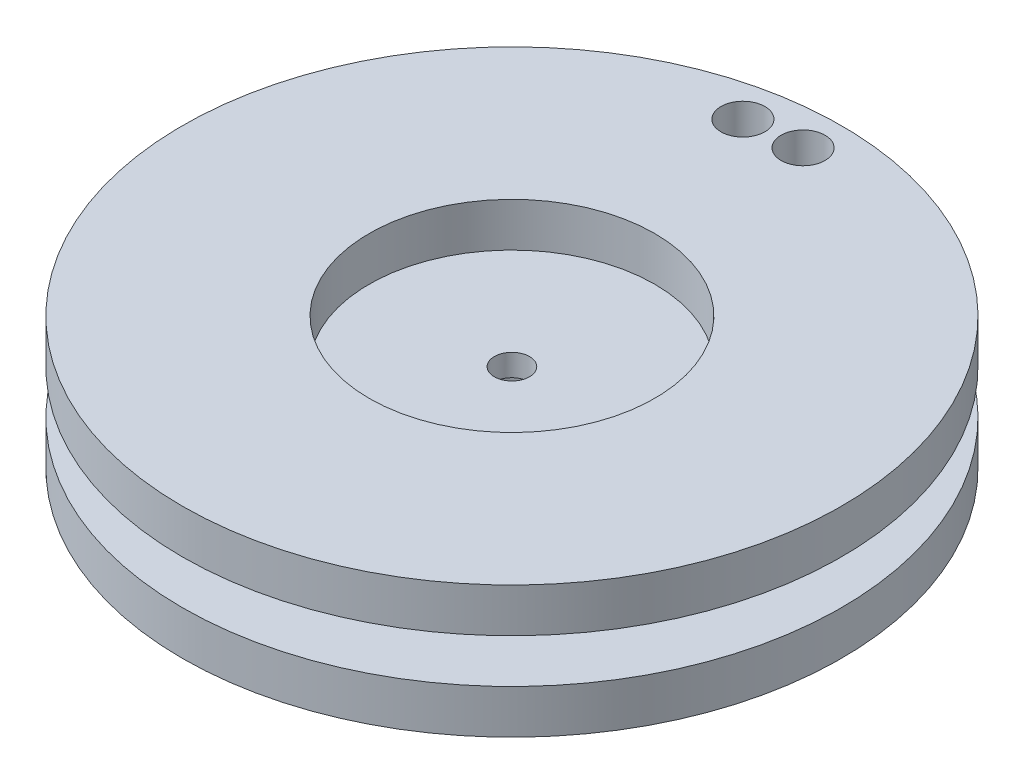
ISO-10303-21;
HEADER;
FILE_DESCRIPTION(('STEP AP214'),'2;1');
FILE_NAME('part.step','',(''),(''),'','','');
FILE_SCHEMA(('AUTOMOTIVE_DESIGN { 1 0 10303 214 1 1 1 1 }'));
ENDSEC;
DATA;
#1=APPLICATION_CONTEXT('core data for automotive mechanical design processes');
#2=APPLICATION_PROTOCOL_DEFINITION('international standard','automotive_design',2000,#1);
#3=PRODUCT_CONTEXT('',#1,'mechanical');
#4=PRODUCT('Part','Part','',(#3));
#5=PRODUCT_RELATED_PRODUCT_CATEGORY('part','',(#4));
#6=PRODUCT_DEFINITION_FORMATION('','',#4);
#7=PRODUCT_DEFINITION_CONTEXT('part definition',#1,'design');
#8=PRODUCT_DEFINITION('design','',#6,#7);
#9=PRODUCT_DEFINITION_SHAPE('','',#8);
#10=(LENGTH_UNIT() NAMED_UNIT(*) SI_UNIT(.MILLI.,.METRE.));
#11=(NAMED_UNIT(*) PLANE_ANGLE_UNIT() SI_UNIT($,.RADIAN.));
#12=(NAMED_UNIT(*) SI_UNIT($,.STERADIAN.) SOLID_ANGLE_UNIT());
#13=UNCERTAINTY_MEASURE_WITH_UNIT(LENGTH_MEASURE(1.E-05),#10,'distance_accuracy_value','');
#14=(GEOMETRIC_REPRESENTATION_CONTEXT(3) GLOBAL_UNCERTAINTY_ASSIGNED_CONTEXT((#13)) GLOBAL_UNIT_ASSIGNED_CONTEXT((#10,
#11,#12)) REPRESENTATION_CONTEXT('',''));
#15=CARTESIAN_POINT('',(0.,0.,0.));
#16=DIRECTION('',(0.,0.,1.));
#17=DIRECTION('',(1.,0.,0.));
#18=AXIS2_PLACEMENT_3D('',#15,#16,#17);
#19=CARTESIAN_POINT('',(0.,2.,0.));
#20=DIRECTION('',(0.,-1.,0.));
#21=DIRECTION('',(0.,0.,-1.));
#22=AXIS2_PLACEMENT_3D('',#19,#20,#21);
#23=CYLINDRICAL_SURFACE('',#22,15.);
#24=CARTESIAN_POINT('',(0.,2.,0.));
#25=DIRECTION('',(0.,1.,0.));
#26=DIRECTION('',(0.,0.,1.));
#27=AXIS2_PLACEMENT_3D('',#24,#25,#26);
#28=CIRCLE('',#27,15.);
#29=CARTESIAN_POINT('',(0.,2.,15.));
#30=VERTEX_POINT('',#29);
#31=EDGE_CURVE('E51',#30,#30,#28,.T.);
#32=ORIENTED_EDGE('',*,*,#31,.F.);
#33=EDGE_LOOP('',(#32));
#34=FACE_BOUND('',#33,.T.);
#35=CARTESIAN_POINT('',(0.,0.,0.));
#36=DIRECTION('',(0.,1.,0.));
#37=DIRECTION('',(0.,0.,1.));
#38=AXIS2_PLACEMENT_3D('',#35,#36,#37);
#39=CIRCLE('',#38,15.);
#40=CARTESIAN_POINT('',(0.,0.,15.));
#41=VERTEX_POINT('',#40);
#42=EDGE_CURVE('E56',#41,#41,#39,.T.);
#43=ORIENTED_EDGE('',*,*,#42,.T.);
#44=EDGE_LOOP('',(#43));
#45=FACE_BOUND('',#44,.T.);
#46=ADVANCED_FACE('F44',(#34,#45),#23,.T.);
#47=CARTESIAN_POINT('',(0.,2.,0.));
#48=DIRECTION('',(0.,1.,0.));
#49=DIRECTION('',(0.,0.,1.));
#50=AXIS2_PLACEMENT_3D('',#47,#48,#49);
#51=PLANE('',#50);
#52=CARTESIAN_POINT('',(0.,2.,-13.25));
#53=DIRECTION('',(0.,1.,0.));
#54=DIRECTION('',(0.,0.,1.));
#55=AXIS2_PLACEMENT_3D('',#52,#53,#54);
#56=CIRCLE('',#55,1.);
#57=CARTESIAN_POINT('',(0.,2.,-12.25));
#58=VERTEX_POINT('',#57);
#59=EDGE_CURVE('E85',#58,#58,#56,.T.);
#60=ORIENTED_EDGE('',*,*,#59,.F.);
#61=EDGE_LOOP('',(#60));
#62=FACE_BOUND('',#61,.T.);
#63=CARTESIAN_POINT('',(-2.5,2.,-13.0120136796731));
#64=DIRECTION('',(0.,1.,0.));
#65=DIRECTION('',(0.,0.,1.));
#66=AXIS2_PLACEMENT_3D('',#63,#64,#65);
#67=CIRCLE('',#66,1.);
#68=CARTESIAN_POINT('',(-2.5,2.,-12.0120136796731));
#69=VERTEX_POINT('',#68);
#70=EDGE_CURVE('E65',#69,#69,#67,.T.);
#71=ORIENTED_EDGE('',*,*,#70,.F.);
#72=EDGE_LOOP('',(#71));
#73=FACE_BOUND('',#72,.T.);
#74=CARTESIAN_POINT('',(0.,2.,0.));
#75=DIRECTION('',(0.,1.,0.));
#76=DIRECTION('',(0.,0.,1.));
#77=AXIS2_PLACEMENT_3D('',#74,#75,#76);
#78=CIRCLE('',#77,12.);
#79=CARTESIAN_POINT('',(0.,2.,12.));
#80=VERTEX_POINT('',#79);
#81=EDGE_CURVE('E12',#80,#80,#78,.T.);
#82=ORIENTED_EDGE('',*,*,#81,.F.);
#83=EDGE_LOOP('',(#82));
#84=FACE_BOUND('',#83,.T.);
#85=ORIENTED_EDGE('',*,*,#31,.T.);
#86=EDGE_LOOP('',(#85));
#87=FACE_BOUND('',#86,.T.);
#88=ADVANCED_FACE('F132',(#62,#73,#84,#87),#51,.T.);
#89=CARTESIAN_POINT('',(0.,0.,0.));
#90=DIRECTION('',(0.,1.,0.));
#91=DIRECTION('',(0.,0.,1.));
#92=AXIS2_PLACEMENT_3D('',#89,#90,#91);
#93=PLANE('',#92);
#94=CARTESIAN_POINT('',(0.,0.,-13.25));
#95=DIRECTION('',(0.,1.,0.));
#96=DIRECTION('',(0.,0.,1.));
#97=AXIS2_PLACEMENT_3D('',#94,#95,#96);
#98=CIRCLE('',#97,1.);
#99=CARTESIAN_POINT('',(0.,0.,-12.25));
#100=VERTEX_POINT('',#99);
#101=EDGE_CURVE('E66',#100,#100,#98,.T.);
#102=ORIENTED_EDGE('',*,*,#101,.T.);
#103=EDGE_LOOP('',(#102));
#104=FACE_BOUND('',#103,.T.);
#105=CARTESIAN_POINT('',(-2.5,0.,-13.0120136796731));
#106=DIRECTION('',(0.,1.,0.));
#107=DIRECTION('',(0.,0.,1.));
#108=AXIS2_PLACEMENT_3D('',#105,#106,#107);
#109=CIRCLE('',#108,1.);
#110=CARTESIAN_POINT('',(-2.5,0.,-12.0120136796731));
#111=VERTEX_POINT('',#110);
#112=EDGE_CURVE('E77',#111,#111,#109,.T.);
#113=ORIENTED_EDGE('',*,*,#112,.T.);
#114=EDGE_LOOP('',(#113));
#115=FACE_BOUND('',#114,.T.);
#116=CARTESIAN_POINT('',(0.,0.,0.));
#117=DIRECTION('',(0.,-1.,0.));
#118=DIRECTION('',(0.,0.,-1.));
#119=AXIS2_PLACEMENT_3D('',#116,#117,#118);
#120=CIRCLE('',#119,2.5);
#121=CARTESIAN_POINT('',(0.,0.,-2.5));
#122=VERTEX_POINT('',#121);
#123=EDGE_CURVE('E98',#122,#122,#120,.T.);
#124=ORIENTED_EDGE('',*,*,#123,.F.);
#125=EDGE_LOOP('',(#124));
#126=FACE_BOUND('',#125,.T.);
#127=ORIENTED_EDGE('',*,*,#42,.F.);
#128=EDGE_LOOP('',(#127));
#129=FACE_BOUND('',#128,.T.);
#130=ADVANCED_FACE('F137',(#104,#115,#126,#129),#93,.F.);
#131=CARTESIAN_POINT('',(0.,4.,0.));
#132=DIRECTION('',(0.,-1.,0.));
#133=DIRECTION('',(0.,0.,-1.));
#134=AXIS2_PLACEMENT_3D('',#131,#132,#133);
#135=CYLINDRICAL_SURFACE('',#134,12.);
#136=CARTESIAN_POINT('',(0.,4.,0.));
#137=DIRECTION('',(0.,1.,0.));
#138=DIRECTION('',(0.,0.,1.));
#139=AXIS2_PLACEMENT_3D('',#136,#137,#138);
#140=CIRCLE('',#139,12.);
#141=CARTESIAN_POINT('',(0.,4.,12.));
#142=VERTEX_POINT('',#141);
#143=EDGE_CURVE('E59',#142,#142,#140,.T.);
#144=ORIENTED_EDGE('',*,*,#143,.F.);
#145=EDGE_LOOP('',(#144));
#146=FACE_BOUND('',#145,.T.);
#147=ORIENTED_EDGE('',*,*,#81,.T.);
#148=EDGE_LOOP('',(#147));
#149=FACE_BOUND('',#148,.T.);
#150=ADVANCED_FACE('F145',(#146,#149),#135,.T.);
#151=CARTESIAN_POINT('',(0.,6.,0.));
#152=DIRECTION('',(0.,-1.,0.));
#153=DIRECTION('',(0.,0.,-1.));
#154=AXIS2_PLACEMENT_3D('',#151,#152,#153);
#155=CYLINDRICAL_SURFACE('',#154,15.);
#156=CARTESIAN_POINT('',(0.,6.,0.));
#157=DIRECTION('',(0.,1.,0.));
#158=DIRECTION('',(0.,0.,1.));
#159=AXIS2_PLACEMENT_3D('',#156,#157,#158);
#160=CIRCLE('',#159,15.);
#161=CARTESIAN_POINT('',(0.,6.,15.));
#162=VERTEX_POINT('',#161);
#163=EDGE_CURVE('E107',#162,#162,#160,.T.);
#164=ORIENTED_EDGE('',*,*,#163,.F.);
#165=EDGE_LOOP('',(#164));
#166=FACE_BOUND('',#165,.T.);
#167=CARTESIAN_POINT('',(0.,4.,0.));
#168=DIRECTION('',(0.,1.,0.));
#169=DIRECTION('',(0.,0.,1.));
#170=AXIS2_PLACEMENT_3D('',#167,#168,#169);
#171=CIRCLE('',#170,15.);
#172=CARTESIAN_POINT('',(0.,4.,15.));
#173=VERTEX_POINT('',#172);
#174=EDGE_CURVE('E104',#173,#173,#171,.T.);
#175=ORIENTED_EDGE('',*,*,#174,.T.);
#176=EDGE_LOOP('',(#175));
#177=FACE_BOUND('',#176,.T.);
#178=ADVANCED_FACE('F112',(#166,#177),#155,.T.);
#179=CARTESIAN_POINT('',(0.,6.,0.));
#180=DIRECTION('',(0.,1.,0.));
#181=DIRECTION('',(0.,0.,1.));
#182=AXIS2_PLACEMENT_3D('',#179,#180,#181);
#183=PLANE('',#182);
#184=CARTESIAN_POINT('',(0.,6.,-13.25));
#185=DIRECTION('',(0.,1.,0.));
#186=DIRECTION('',(0.,0.,1.));
#187=AXIS2_PLACEMENT_3D('',#184,#185,#186);
#188=CIRCLE('',#187,1.);
#189=CARTESIAN_POINT('',(0.,6.,-12.25));
#190=VERTEX_POINT('',#189);
#191=EDGE_CURVE('E72',#190,#190,#188,.T.);
#192=ORIENTED_EDGE('',*,*,#191,.F.);
#193=EDGE_LOOP('',(#192));
#194=FACE_BOUND('',#193,.T.);
#195=CARTESIAN_POINT('',(-2.5,6.,-13.0120136796731));
#196=DIRECTION('',(0.,1.,0.));
#197=DIRECTION('',(0.,0.,1.));
#198=AXIS2_PLACEMENT_3D('',#195,#196,#197);
#199=CIRCLE('',#198,1.);
#200=CARTESIAN_POINT('',(-2.5,6.,-12.0120136796731));
#201=VERTEX_POINT('',#200);
#202=EDGE_CURVE('E82',#201,#201,#199,.T.);
#203=ORIENTED_EDGE('',*,*,#202,.F.);
#204=EDGE_LOOP('',(#203));
#205=FACE_BOUND('',#204,.T.);
#206=CARTESIAN_POINT('',(0.,6.,0.));
#207=DIRECTION('',(0.,1.,0.));
#208=DIRECTION('',(0.,0.,1.));
#209=AXIS2_PLACEMENT_3D('',#206,#207,#208);
#210=CIRCLE('',#209,6.5);
#211=CARTESIAN_POINT('',(0.,6.,6.5));
#212=VERTEX_POINT('',#211);
#213=EDGE_CURVE('E94',#212,#212,#210,.T.);
#214=ORIENTED_EDGE('',*,*,#213,.F.);
#215=EDGE_LOOP('',(#214));
#216=FACE_BOUND('',#215,.T.);
#217=ORIENTED_EDGE('',*,*,#163,.T.);
#218=EDGE_LOOP('',(#217));
#219=FACE_BOUND('',#218,.T.);
#220=ADVANCED_FACE('F117',(#194,#205,#216,#219),#183,.T.);
#221=CARTESIAN_POINT('',(0.,4.,0.));
#222=DIRECTION('',(0.,1.,0.));
#223=DIRECTION('',(0.,0.,1.));
#224=AXIS2_PLACEMENT_3D('',#221,#222,#223);
#225=PLANE('',#224);
#226=CARTESIAN_POINT('',(0.,4.,-13.25));
#227=DIRECTION('',(0.,1.,0.));
#228=DIRECTION('',(0.,0.,1.));
#229=AXIS2_PLACEMENT_3D('',#226,#227,#228);
#230=CIRCLE('',#229,1.);
#231=CARTESIAN_POINT('',(0.,4.,-12.25));
#232=VERTEX_POINT('',#231);
#233=EDGE_CURVE('E47',#232,#232,#230,.T.);
#234=ORIENTED_EDGE('',*,*,#233,.T.);
#235=EDGE_LOOP('',(#234));
#236=FACE_BOUND('',#235,.T.);
#237=CARTESIAN_POINT('',(-2.5,4.,-13.0120136796731));
#238=DIRECTION('',(0.,1.,0.));
#239=DIRECTION('',(0.,0.,1.));
#240=AXIS2_PLACEMENT_3D('',#237,#238,#239);
#241=CIRCLE('',#240,1.);
#242=CARTESIAN_POINT('',(-2.5,4.,-12.0120136796731));
#243=VERTEX_POINT('',#242);
#244=EDGE_CURVE('E63',#243,#243,#241,.T.);
#245=ORIENTED_EDGE('',*,*,#244,.T.);
#246=EDGE_LOOP('',(#245));
#247=FACE_BOUND('',#246,.T.);
#248=ORIENTED_EDGE('',*,*,#143,.T.);
#249=EDGE_LOOP('',(#248));
#250=FACE_BOUND('',#249,.T.);
#251=ORIENTED_EDGE('',*,*,#174,.F.);
#252=EDGE_LOOP('',(#251));
#253=FACE_BOUND('',#252,.T.);
#254=ADVANCED_FACE('F114',(#236,#247,#250,#253),#225,.F.);
#255=CARTESIAN_POINT('',(0.,3.,0.));
#256=DIRECTION('',(0.,-1.,0.));
#257=DIRECTION('',(0.,0.,-1.));
#258=AXIS2_PLACEMENT_3D('',#255,#256,#257);
#259=CYLINDRICAL_SURFACE('',#258,2.5);
#260=CARTESIAN_POINT('',(0.,3.,0.));
#261=DIRECTION('',(0.,-1.,0.));
#262=DIRECTION('',(0.,0.,-1.));
#263=AXIS2_PLACEMENT_3D('',#260,#261,#262);
#264=CIRCLE('',#263,2.5);
#265=CARTESIAN_POINT('',(0.,3.,-2.5));
#266=VERTEX_POINT('',#265);
#267=EDGE_CURVE('E101',#266,#266,#264,.T.);
#268=ORIENTED_EDGE('',*,*,#267,.F.);
#269=EDGE_LOOP('',(#268));
#270=FACE_BOUND('',#269,.T.);
#271=ORIENTED_EDGE('',*,*,#123,.T.);
#272=EDGE_LOOP('',(#271));
#273=FACE_BOUND('',#272,.T.);
#274=ADVANCED_FACE('F116',(#270,#273),#259,.F.);
#275=CARTESIAN_POINT('',(0.,3.,0.));
#276=DIRECTION('',(0.,-1.,0.));
#277=DIRECTION('',(0.,0.,-1.));
#278=AXIS2_PLACEMENT_3D('',#275,#276,#277);
#279=PLANE('',#278);
#280=CARTESIAN_POINT('',(0.,3.,0.));
#281=DIRECTION('',(0.,-1.,0.));
#282=DIRECTION('',(0.,0.,-1.));
#283=AXIS2_PLACEMENT_3D('',#280,#281,#282);
#284=CIRCLE('',#283,0.8);
#285=CARTESIAN_POINT('',(0.,3.,-0.8));
#286=VERTEX_POINT('',#285);
#287=EDGE_CURVE('E91',#286,#286,#284,.T.);
#288=ORIENTED_EDGE('',*,*,#287,.F.);
#289=EDGE_LOOP('',(#288));
#290=FACE_BOUND('',#289,.T.);
#291=ORIENTED_EDGE('',*,*,#267,.T.);
#292=EDGE_LOOP('',(#291));
#293=FACE_BOUND('',#292,.T.);
#294=ADVANCED_FACE('F124',(#290,#293),#279,.T.);
#295=CARTESIAN_POINT('',(0.,4.,0.));
#296=DIRECTION('',(0.,1.,0.));
#297=DIRECTION('',(0.,0.,1.));
#298=AXIS2_PLACEMENT_3D('',#295,#296,#297);
#299=CYLINDRICAL_SURFACE('',#298,6.5);
#300=CARTESIAN_POINT('',(0.,4.,0.));
#301=DIRECTION('',(0.,1.,0.));
#302=DIRECTION('',(0.,0.,1.));
#303=AXIS2_PLACEMENT_3D('',#300,#301,#302);
#304=CIRCLE('',#303,6.5);
#305=CARTESIAN_POINT('',(0.,4.,6.5));
#306=VERTEX_POINT('',#305);
#307=EDGE_CURVE('E95',#306,#306,#304,.T.);
#308=ORIENTED_EDGE('',*,*,#307,.F.);
#309=EDGE_LOOP('',(#308));
#310=FACE_BOUND('',#309,.T.);
#311=ORIENTED_EDGE('',*,*,#213,.T.);
#312=EDGE_LOOP('',(#311));
#313=FACE_BOUND('',#312,.T.);
#314=ADVANCED_FACE('F225',(#310,#313),#299,.F.);
#315=CARTESIAN_POINT('',(0.,4.,0.));
#316=DIRECTION('',(0.,1.,0.));
#317=DIRECTION('',(0.,0.,1.));
#318=AXIS2_PLACEMENT_3D('',#315,#316,#317);
#319=PLANE('',#318);
#320=CARTESIAN_POINT('',(0.,4.,0.));
#321=DIRECTION('',(0.,1.,0.));
#322=DIRECTION('',(0.,0.,1.));
#323=AXIS2_PLACEMENT_3D('',#320,#321,#322);
#324=CIRCLE('',#323,0.8);
#325=CARTESIAN_POINT('',(0.,4.,0.8));
#326=VERTEX_POINT('',#325);
#327=EDGE_CURVE('E88',#326,#326,#324,.T.);
#328=ORIENTED_EDGE('',*,*,#327,.F.);
#329=EDGE_LOOP('',(#328));
#330=FACE_BOUND('',#329,.T.);
#331=ORIENTED_EDGE('',*,*,#307,.T.);
#332=EDGE_LOOP('',(#331));
#333=FACE_BOUND('',#332,.T.);
#334=ADVANCED_FACE('F221',(#330,#333),#319,.T.);
#335=CARTESIAN_POINT('',(0.,0.,0.));
#336=DIRECTION('',(0.,1.,0.));
#337=DIRECTION('',(0.,0.,1.));
#338=AXIS2_PLACEMENT_3D('',#335,#336,#337);
#339=CYLINDRICAL_SURFACE('',#338,0.8);
#340=ORIENTED_EDGE('',*,*,#287,.T.);
#341=EDGE_LOOP('',(#340));
#342=FACE_BOUND('',#341,.T.);
#343=ORIENTED_EDGE('',*,*,#327,.T.);
#344=EDGE_LOOP('',(#343));
#345=FACE_BOUND('',#344,.T.);
#346=ADVANCED_FACE('F184',(#342,#345),#339,.F.);
#347=CARTESIAN_POINT('',(-2.5,0.,-13.0120136796731));
#348=DIRECTION('',(0.,1.,0.));
#349=DIRECTION('',(0.,0.,1.));
#350=AXIS2_PLACEMENT_3D('',#347,#348,#349);
#351=CYLINDRICAL_SURFACE('',#350,1.);
#352=ORIENTED_EDGE('',*,*,#202,.T.);
#353=EDGE_LOOP('',(#352));
#354=FACE_BOUND('',#353,.T.);
#355=ORIENTED_EDGE('',*,*,#244,.F.);
#356=EDGE_LOOP('',(#355));
#357=FACE_BOUND('',#356,.T.);
#358=ADVANCED_FACE('F178',(#354,#357),#351,.F.);
#359=CARTESIAN_POINT('',(0.,0.,-13.25));
#360=DIRECTION('',(0.,1.,0.));
#361=DIRECTION('',(0.,0.,1.));
#362=AXIS2_PLACEMENT_3D('',#359,#360,#361);
#363=CYLINDRICAL_SURFACE('',#362,1.);
#364=ORIENTED_EDGE('',*,*,#191,.T.);
#365=EDGE_LOOP('',(#364));
#366=FACE_BOUND('',#365,.T.);
#367=ORIENTED_EDGE('',*,*,#233,.F.);
#368=EDGE_LOOP('',(#367));
#369=FACE_BOUND('',#368,.T.);
#370=ADVANCED_FACE('F183',(#366,#369),#363,.F.);
#371=ORIENTED_EDGE('',*,*,#70,.T.);
#372=EDGE_LOOP('',(#371));
#373=FACE_BOUND('',#372,.T.);
#374=ORIENTED_EDGE('',*,*,#112,.F.);
#375=EDGE_LOOP('',(#374));
#376=FACE_BOUND('',#375,.T.);
#377=ADVANCED_FACE('F187',(#373,#376),#351,.F.);
#378=ORIENTED_EDGE('',*,*,#59,.T.);
#379=EDGE_LOOP('',(#378));
#380=FACE_BOUND('',#379,.T.);
#381=ORIENTED_EDGE('',*,*,#101,.F.);
#382=EDGE_LOOP('',(#381));
#383=FACE_BOUND('',#382,.T.);
#384=ADVANCED_FACE('F199',(#380,#383),#363,.F.);
#385=CLOSED_SHELL('',(#46,#88,#130,#150,#178,#220,#254,#274,#294,#314,#334,#346,#358,#370,#377,#384));
#386=MANIFOLD_SOLID_BREP('B2',#385);
#387=ADVANCED_BREP_SHAPE_REPRESENTATION('',(#18,#386),#14);
#388=SHAPE_DEFINITION_REPRESENTATION(#9,#387);
ENDSEC;
END-ISO-10303-21;
